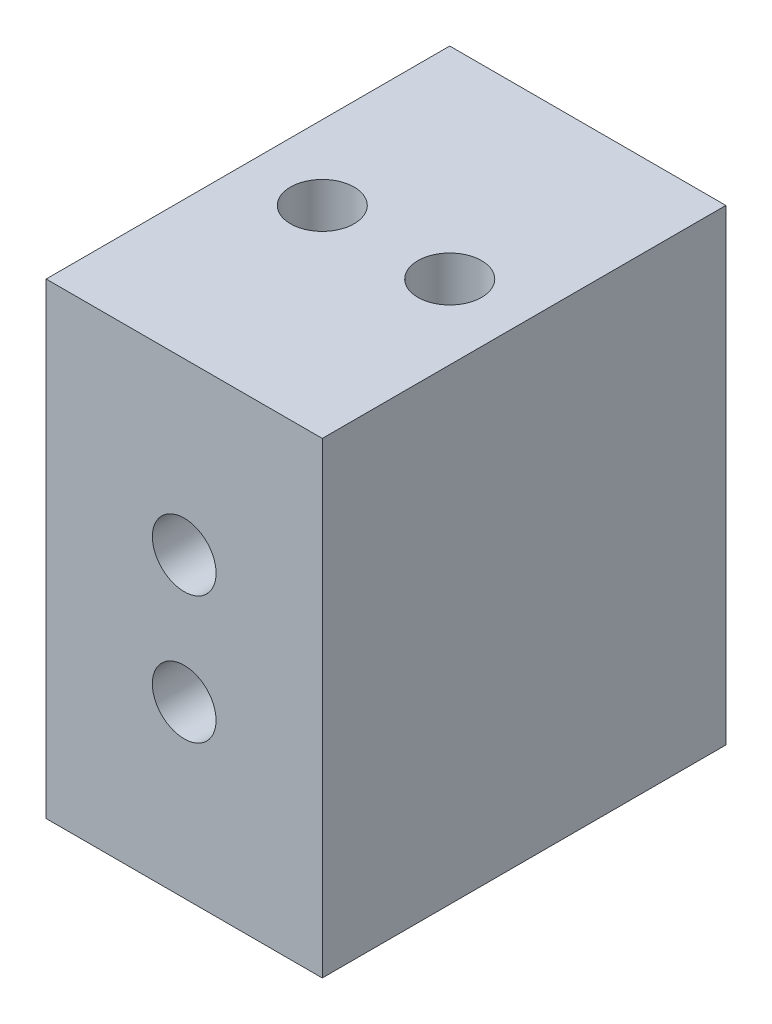
ISO-10303-21;
HEADER;
FILE_DESCRIPTION(('STEP AP214'),'2;1');
FILE_NAME('part.step','',(''),(''),'','','');
FILE_SCHEMA(('AUTOMOTIVE_DESIGN { 1 0 10303 214 1 1 1 1 }'));
ENDSEC;
DATA;
#1=APPLICATION_CONTEXT('core data for automotive mechanical design processes');
#2=APPLICATION_PROTOCOL_DEFINITION('international standard','automotive_design',2000,#1);
#3=PRODUCT_CONTEXT('',#1,'mechanical');
#4=PRODUCT('Part','Part','',(#3));
#5=PRODUCT_RELATED_PRODUCT_CATEGORY('part','',(#4));
#6=PRODUCT_DEFINITION_FORMATION('','',#4);
#7=PRODUCT_DEFINITION_CONTEXT('part definition',#1,'design');
#8=PRODUCT_DEFINITION('design','',#6,#7);
#9=PRODUCT_DEFINITION_SHAPE('','',#8);
#10=(LENGTH_UNIT() NAMED_UNIT(*) SI_UNIT(.MILLI.,.METRE.));
#11=(NAMED_UNIT(*) PLANE_ANGLE_UNIT() SI_UNIT($,.RADIAN.));
#12=(NAMED_UNIT(*) SI_UNIT($,.STERADIAN.) SOLID_ANGLE_UNIT());
#13=UNCERTAINTY_MEASURE_WITH_UNIT(LENGTH_MEASURE(1.E-05),#10,'distance_accuracy_value','');
#14=(GEOMETRIC_REPRESENTATION_CONTEXT(3) GLOBAL_UNCERTAINTY_ASSIGNED_CONTEXT((#13)) GLOBAL_UNIT_ASSIGNED_CONTEXT((#10,
#11,#12)) REPRESENTATION_CONTEXT('',''));
#15=CARTESIAN_POINT('',(0.,0.,0.));
#16=DIRECTION('',(0.,0.,1.));
#17=DIRECTION('',(1.,0.,0.));
#18=AXIS2_PLACEMENT_3D('',#15,#16,#17);
#19=CARTESIAN_POINT('',(6.5,22.,-9.5));
#20=DIRECTION('',(-1.,0.,0.));
#21=DIRECTION('',(0.,0.,1.));
#22=AXIS2_PLACEMENT_3D('',#19,#20,#21);
#23=PLANE('',#22);
#24=DIRECTION('',(0.,0.,-1.));
#25=VECTOR('',#24,1.);
#26=CARTESIAN_POINT('',(6.5,0.,-9.5));
#27=LINE('',#26,#25);
#28=CARTESIAN_POINT('',(6.5,0.,9.5));
#29=VERTEX_POINT('',#28);
#30=CARTESIAN_POINT('',(6.5,0.,-9.5));
#31=VERTEX_POINT('',#30);
#32=EDGE_CURVE('E102',#29,#31,#27,.T.);
#33=ORIENTED_EDGE('',*,*,#32,.T.);
#34=DIRECTION('',(0.,-1.,0.));
#35=VECTOR('',#34,1.);
#36=CARTESIAN_POINT('',(6.5,22.,-9.5));
#37=LINE('',#36,#35);
#38=CARTESIAN_POINT('',(6.5,22.,-9.5));
#39=VERTEX_POINT('',#38);
#40=EDGE_CURVE('E11',#39,#31,#37,.T.);
#41=ORIENTED_EDGE('',*,*,#40,.F.);
#42=DIRECTION('',(0.,0.,-1.));
#43=VECTOR('',#42,1.);
#44=CARTESIAN_POINT('',(6.5,22.,-9.5));
#45=LINE('',#44,#43);
#46=CARTESIAN_POINT('',(6.5,22.,9.5));
#47=VERTEX_POINT('',#46);
#48=EDGE_CURVE('E90',#47,#39,#45,.T.);
#49=ORIENTED_EDGE('',*,*,#48,.F.);
#50=DIRECTION('',(0.,-1.,0.));
#51=VECTOR('',#50,1.);
#52=CARTESIAN_POINT('',(6.5,22.,9.5));
#53=LINE('',#52,#51);
#54=EDGE_CURVE('E98',#47,#29,#53,.T.);
#55=ORIENTED_EDGE('',*,*,#54,.T.);
#56=EDGE_LOOP('',(#33,#41,#49,#55));
#57=FACE_BOUND('',#56,.T.);
#58=ADVANCED_FACE('F39',(#57),#23,.F.);
#59=CARTESIAN_POINT('',(-6.5,22.,-9.5));
#60=DIRECTION('',(0.,0.,1.));
#61=DIRECTION('',(1.,0.,0.));
#62=AXIS2_PLACEMENT_3D('',#59,#60,#61);
#63=PLANE('',#62);
#64=DIRECTION('',(-1.,0.,0.));
#65=VECTOR('',#64,1.);
#66=CARTESIAN_POINT('',(-6.5,0.,-9.5));
#67=LINE('',#66,#65);
#68=CARTESIAN_POINT('',(-6.5,0.,-9.5));
#69=VERTEX_POINT('',#68);
#70=EDGE_CURVE('E94',#31,#69,#67,.T.);
#71=ORIENTED_EDGE('',*,*,#70,.T.);
#72=DIRECTION('',(0.,-1.,0.));
#73=VECTOR('',#72,1.);
#74=CARTESIAN_POINT('',(-6.5,22.,-9.5));
#75=LINE('',#74,#73);
#76=CARTESIAN_POINT('',(-6.5,22.,-9.5));
#77=VERTEX_POINT('',#76);
#78=EDGE_CURVE('E47',#77,#69,#75,.T.);
#79=ORIENTED_EDGE('',*,*,#78,.F.);
#80=DIRECTION('',(-1.,0.,0.));
#81=VECTOR('',#80,1.);
#82=CARTESIAN_POINT('',(-6.5,22.,-9.5));
#83=LINE('',#82,#81);
#84=EDGE_CURVE('E85',#39,#77,#83,.T.);
#85=ORIENTED_EDGE('',*,*,#84,.F.);
#86=ORIENTED_EDGE('',*,*,#40,.T.);
#87=EDGE_LOOP('',(#71,#79,#85,#86));
#88=FACE_BOUND('',#87,.T.);
#89=ADVANCED_FACE('F93',(#88),#63,.F.);
#90=CARTESIAN_POINT('',(-6.5,22.,-9.5));
#91=DIRECTION('',(1.,0.,0.));
#92=DIRECTION('',(0.,0.,-1.));
#93=AXIS2_PLACEMENT_3D('',#90,#91,#92);
#94=PLANE('',#93);
#95=DIRECTION('',(0.,0.,1.));
#96=VECTOR('',#95,1.);
#97=CARTESIAN_POINT('',(-6.5,0.,-9.5));
#98=LINE('',#97,#96);
#99=CARTESIAN_POINT('',(-6.5,0.,9.5));
#100=VERTEX_POINT('',#99);
#101=EDGE_CURVE('E72',#69,#100,#98,.T.);
#102=ORIENTED_EDGE('',*,*,#101,.T.);
#103=DIRECTION('',(0.,-1.,0.));
#104=VECTOR('',#103,1.);
#105=CARTESIAN_POINT('',(-6.5,22.,9.5));
#106=LINE('',#105,#104);
#107=CARTESIAN_POINT('',(-6.5,22.,9.5));
#108=VERTEX_POINT('',#107);
#109=EDGE_CURVE('E95',#108,#100,#106,.T.);
#110=ORIENTED_EDGE('',*,*,#109,.F.);
#111=DIRECTION('',(0.,0.,1.));
#112=VECTOR('',#111,1.);
#113=CARTESIAN_POINT('',(-6.5,22.,-9.5));
#114=LINE('',#113,#112);
#115=EDGE_CURVE('E88',#77,#108,#114,.T.);
#116=ORIENTED_EDGE('',*,*,#115,.F.);
#117=ORIENTED_EDGE('',*,*,#78,.T.);
#118=EDGE_LOOP('',(#102,#110,#116,#117));
#119=FACE_BOUND('',#118,.T.);
#120=ADVANCED_FACE('F96',(#119),#94,.F.);
#121=CARTESIAN_POINT('',(-6.5,22.,9.5));
#122=DIRECTION('',(0.,0.,-1.));
#123=DIRECTION('',(-1.,0.,0.));
#124=AXIS2_PLACEMENT_3D('',#121,#122,#123);
#125=PLANE('',#124);
#126=CARTESIAN_POINT('',(0.,14.,9.5));
#127=DIRECTION('',(0.,0.,1.));
#128=DIRECTION('',(1.,0.,0.));
#129=AXIS2_PLACEMENT_3D('',#126,#127,#128);
#130=CIRCLE('',#129,1.5);
#131=CARTESIAN_POINT('',(1.5,14.,9.5));
#132=VERTEX_POINT('',#131);
#133=EDGE_CURVE('E123',#132,#132,#130,.T.);
#134=ORIENTED_EDGE('',*,*,#133,.F.);
#135=EDGE_LOOP('',(#134));
#136=FACE_BOUND('',#135,.T.);
#137=CARTESIAN_POINT('',(0.,8.,9.5));
#138=DIRECTION('',(0.,0.,1.));
#139=DIRECTION('',(-1.,0.,0.));
#140=AXIS2_PLACEMENT_3D('',#137,#138,#139);
#141=CIRCLE('',#140,1.5);
#142=CARTESIAN_POINT('',(-1.5,8.,9.5));
#143=VERTEX_POINT('',#142);
#144=EDGE_CURVE('E116',#143,#143,#141,.T.);
#145=ORIENTED_EDGE('',*,*,#144,.F.);
#146=EDGE_LOOP('',(#145));
#147=FACE_BOUND('',#146,.T.);
#148=DIRECTION('',(1.,0.,0.));
#149=VECTOR('',#148,1.);
#150=CARTESIAN_POINT('',(-6.5,0.,9.5));
#151=LINE('',#150,#149);
#152=EDGE_CURVE('E78',#100,#29,#151,.T.);
#153=ORIENTED_EDGE('',*,*,#152,.T.);
#154=ORIENTED_EDGE('',*,*,#54,.F.);
#155=DIRECTION('',(1.,0.,0.));
#156=VECTOR('',#155,1.);
#157=CARTESIAN_POINT('',(-6.5,22.,9.5));
#158=LINE('',#157,#156);
#159=EDGE_CURVE('E55',#108,#47,#158,.T.);
#160=ORIENTED_EDGE('',*,*,#159,.F.);
#161=ORIENTED_EDGE('',*,*,#109,.T.);
#162=EDGE_LOOP('',(#153,#154,#160,#161));
#163=FACE_BOUND('',#162,.T.);
#164=ADVANCED_FACE('F110',(#136,#147,#163),#125,.F.);
#165=CARTESIAN_POINT('',(0.,22.,0.));
#166=DIRECTION('',(0.,1.,0.));
#167=DIRECTION('',(0.,0.,1.));
#168=AXIS2_PLACEMENT_3D('',#165,#166,#167);
#169=PLANE('',#168);
#170=CARTESIAN_POINT('',(3.,22.,0.));
#171=DIRECTION('',(0.,1.,0.));
#172=DIRECTION('',(0.,0.,1.));
#173=AXIS2_PLACEMENT_3D('',#170,#171,#172);
#174=CIRCLE('',#173,1.5);
#175=CARTESIAN_POINT('',(3.,22.,1.5));
#176=VERTEX_POINT('',#175);
#177=EDGE_CURVE('E131',#176,#176,#174,.T.);
#178=ORIENTED_EDGE('',*,*,#177,.F.);
#179=EDGE_LOOP('',(#178));
#180=FACE_BOUND('',#179,.T.);
#181=CARTESIAN_POINT('',(-3.,22.,0.));
#182=DIRECTION('',(0.,1.,0.));
#183=DIRECTION('',(0.,0.,-1.));
#184=AXIS2_PLACEMENT_3D('',#181,#182,#183);
#185=CIRCLE('',#184,1.5);
#186=CARTESIAN_POINT('',(-3.,22.,1.5));
#187=VERTEX_POINT('',#186);
#188=EDGE_CURVE('E132',#187,#187,#185,.T.);
#189=ORIENTED_EDGE('',*,*,#188,.F.);
#190=EDGE_LOOP('',(#189));
#191=FACE_BOUND('',#190,.T.);
#192=ORIENTED_EDGE('',*,*,#48,.T.);
#193=ORIENTED_EDGE('',*,*,#84,.T.);
#194=ORIENTED_EDGE('',*,*,#115,.T.);
#195=ORIENTED_EDGE('',*,*,#159,.T.);
#196=EDGE_LOOP('',(#192,#193,#194,#195));
#197=FACE_BOUND('',#196,.T.);
#198=ADVANCED_FACE('F86',(#180,#191,#197),#169,.T.);
#199=CARTESIAN_POINT('',(0.,0.,0.));
#200=DIRECTION('',(0.,1.,0.));
#201=DIRECTION('',(0.,0.,1.));
#202=AXIS2_PLACEMENT_3D('',#199,#200,#201);
#203=PLANE('',#202);
#204=CARTESIAN_POINT('',(3.,0.,0.));
#205=DIRECTION('',(0.,1.,0.));
#206=DIRECTION('',(0.,0.,1.));
#207=AXIS2_PLACEMENT_3D('',#204,#205,#206);
#208=CIRCLE('',#207,1.5);
#209=CARTESIAN_POINT('',(3.,0.,1.5));
#210=VERTEX_POINT('',#209);
#211=EDGE_CURVE('E120',#210,#210,#208,.F.);
#212=ORIENTED_EDGE('',*,*,#211,.F.);
#213=EDGE_LOOP('',(#212));
#214=FACE_BOUND('',#213,.T.);
#215=CARTESIAN_POINT('',(-3.,0.,0.));
#216=DIRECTION('',(0.,1.,0.));
#217=DIRECTION('',(0.,0.,1.));
#218=AXIS2_PLACEMENT_3D('',#215,#216,#217);
#219=CIRCLE('',#218,1.5);
#220=CARTESIAN_POINT('',(-3.,0.,1.5));
#221=VERTEX_POINT('',#220);
#222=EDGE_CURVE('E128',#221,#221,#219,.F.);
#223=ORIENTED_EDGE('',*,*,#222,.F.);
#224=EDGE_LOOP('',(#223));
#225=FACE_BOUND('',#224,.T.);
#226=ORIENTED_EDGE('',*,*,#32,.F.);
#227=ORIENTED_EDGE('',*,*,#152,.F.);
#228=ORIENTED_EDGE('',*,*,#101,.F.);
#229=ORIENTED_EDGE('',*,*,#70,.F.);
#230=EDGE_LOOP('',(#226,#227,#228,#229));
#231=FACE_BOUND('',#230,.T.);
#232=ADVANCED_FACE('F113',(#214,#225,#231),#203,.F.);
#233=CARTESIAN_POINT('',(0.,8.,1.5));
#234=DIRECTION('',(0.,0.,1.));
#235=DIRECTION('',(1.,0.,0.));
#236=AXIS2_PLACEMENT_3D('',#233,#234,#235);
#237=CYLINDRICAL_SURFACE('',#236,1.5);
#238=CARTESIAN_POINT('',(0.,8.,1.5));
#239=DIRECTION('',(0.,0.,1.));
#240=DIRECTION('',(-1.,0.,0.));
#241=AXIS2_PLACEMENT_3D('',#238,#239,#240);
#242=CIRCLE('',#241,1.5);
#243=CARTESIAN_POINT('',(-1.5,8.,1.5));
#244=VERTEX_POINT('',#243);
#245=EDGE_CURVE('E119',#244,#244,#242,.T.);
#246=ORIENTED_EDGE('',*,*,#245,.F.);
#247=EDGE_LOOP('',(#246));
#248=FACE_BOUND('',#247,.T.);
#249=ORIENTED_EDGE('',*,*,#144,.T.);
#250=EDGE_LOOP('',(#249));
#251=FACE_BOUND('',#250,.T.);
#252=ADVANCED_FACE('F174',(#248,#251),#237,.F.);
#253=CARTESIAN_POINT('',(0.,8.,1.5));
#254=DIRECTION('',(0.,0.,-1.));
#255=DIRECTION('',(-1.,0.,0.));
#256=AXIS2_PLACEMENT_3D('',#253,#254,#255);
#257=PLANE('',#256);
#258=ORIENTED_EDGE('',*,*,#245,.T.);
#259=EDGE_LOOP('',(#258));
#260=FACE_BOUND('',#259,.T.);
#261=ADVANCED_FACE('F179',(#260),#257,.F.);
#262=CARTESIAN_POINT('',(0.,14.,1.5));
#263=DIRECTION('',(0.,0.,1.));
#264=DIRECTION('',(1.,0.,0.));
#265=AXIS2_PLACEMENT_3D('',#262,#263,#264);
#266=CYLINDRICAL_SURFACE('',#265,1.5);
#267=CARTESIAN_POINT('',(0.,14.,1.5));
#268=DIRECTION('',(0.,0.,1.));
#269=DIRECTION('',(1.,0.,0.));
#270=AXIS2_PLACEMENT_3D('',#267,#268,#269);
#271=CIRCLE('',#270,1.5);
#272=CARTESIAN_POINT('',(1.5,14.,1.5));
#273=VERTEX_POINT('',#272);
#274=EDGE_CURVE('E105',#273,#273,#271,.T.);
#275=ORIENTED_EDGE('',*,*,#274,.F.);
#276=EDGE_LOOP('',(#275));
#277=FACE_BOUND('',#276,.T.);
#278=ORIENTED_EDGE('',*,*,#133,.T.);
#279=EDGE_LOOP('',(#278));
#280=FACE_BOUND('',#279,.T.);
#281=ADVANCED_FACE('F158',(#277,#280),#266,.F.);
#282=CARTESIAN_POINT('',(0.,14.,1.5));
#283=DIRECTION('',(0.,0.,1.));
#284=DIRECTION('',(1.,0.,0.));
#285=AXIS2_PLACEMENT_3D('',#282,#283,#284);
#286=PLANE('',#285);
#287=ORIENTED_EDGE('',*,*,#274,.T.);
#288=EDGE_LOOP('',(#287));
#289=FACE_BOUND('',#288,.T.);
#290=ADVANCED_FACE('F149',(#289),#286,.T.);
#291=CARTESIAN_POINT('',(-3.,-4.24264068711928,0.));
#292=DIRECTION('',(0.,1.,0.));
#293=DIRECTION('',(0.,0.,1.));
#294=AXIS2_PLACEMENT_3D('',#291,#292,#293);
#295=CYLINDRICAL_SURFACE('',#294,1.5);
#296=CARTESIAN_POINT('',(-3.,0.,1.5));
#297=CARTESIAN_POINT('',(-3.,0.229166666666666,1.5));
#298=CARTESIAN_POINT('',(-3.,0.458333333333332,1.5));
#299=CARTESIAN_POINT('',(-3.,0.916666666666665,1.5));
#300=CARTESIAN_POINT('',(-3.,1.14583333333333,1.5));
#301=CARTESIAN_POINT('',(-3.,1.60416666666667,1.5));
#302=CARTESIAN_POINT('',(-3.,1.83333333333333,1.5));
#303=CARTESIAN_POINT('',(-3.,2.29166666666667,1.5));
#304=CARTESIAN_POINT('',(-3.,2.52083333333333,1.5));
#305=CARTESIAN_POINT('',(-3.,2.97916666666667,1.5));
#306=CARTESIAN_POINT('',(-3.,3.20833333333333,1.5));
#307=CARTESIAN_POINT('',(-3.,3.66666666666667,1.5));
#308=CARTESIAN_POINT('',(-3.,3.89583333333333,1.5));
#309=CARTESIAN_POINT('',(-3.,4.35416666666667,1.5));
#310=CARTESIAN_POINT('',(-3.,4.58333333333333,1.5));
#311=CARTESIAN_POINT('',(-3.,5.04166666666667,1.5));
#312=CARTESIAN_POINT('',(-3.,5.27083333333333,1.5));
#313=CARTESIAN_POINT('',(-3.,5.72916666666666,1.5));
#314=CARTESIAN_POINT('',(-3.,5.95833333333333,1.5));
#315=CARTESIAN_POINT('',(-3.,6.41666666666666,1.5));
#316=CARTESIAN_POINT('',(-3.,6.64583333333333,1.5));
#317=CARTESIAN_POINT('',(-3.,7.10416666666666,1.5));
#318=CARTESIAN_POINT('',(-3.,7.33333333333333,1.5));
#319=CARTESIAN_POINT('',(-3.,7.79166666666666,1.5));
#320=CARTESIAN_POINT('',(-3.,8.02083333333333,1.5));
#321=CARTESIAN_POINT('',(-3.,8.47916666666666,1.5));
#322=CARTESIAN_POINT('',(-3.,8.70833333333333,1.5));
#323=CARTESIAN_POINT('',(-3.,9.16666666666666,1.5));
#324=CARTESIAN_POINT('',(-3.,9.39583333333333,1.5));
#325=CARTESIAN_POINT('',(-3.,9.85416666666666,1.5));
#326=CARTESIAN_POINT('',(-3.,10.0833333333333,1.5));
#327=CARTESIAN_POINT('',(-3.,10.5416666666667,1.5));
#328=CARTESIAN_POINT('',(-3.,10.7708333333333,1.5));
#329=CARTESIAN_POINT('',(-3.,11.2291666666667,1.5));
#330=CARTESIAN_POINT('',(-3.,11.4583333333333,1.5));
#331=CARTESIAN_POINT('',(-3.,11.9166666666667,1.5));
#332=CARTESIAN_POINT('',(-3.,12.1458333333333,1.5));
#333=CARTESIAN_POINT('',(-3.,12.6041666666667,1.5));
#334=CARTESIAN_POINT('',(-3.,12.8333333333333,1.5));
#335=CARTESIAN_POINT('',(-3.,13.2916666666667,1.5));
#336=CARTESIAN_POINT('',(-3.,13.5208333333333,1.5));
#337=CARTESIAN_POINT('',(-3.,13.9791666666667,1.5));
#338=CARTESIAN_POINT('',(-3.,14.2083333333333,1.5));
#339=CARTESIAN_POINT('',(-3.,14.6666666666667,1.5));
#340=CARTESIAN_POINT('',(-3.,14.8958333333333,1.5));
#341=CARTESIAN_POINT('',(-3.,15.3541666666667,1.5));
#342=CARTESIAN_POINT('',(-3.,15.5833333333333,1.5));
#343=CARTESIAN_POINT('',(-3.,16.0416666666667,1.5));
#344=CARTESIAN_POINT('',(-3.,16.2708333333333,1.5));
#345=CARTESIAN_POINT('',(-3.,16.7291666666667,1.5));
#346=CARTESIAN_POINT('',(-3.,16.9583333333333,1.5));
#347=CARTESIAN_POINT('',(-3.,17.4166666666667,1.5));
#348=CARTESIAN_POINT('',(-3.,17.6458333333333,1.5));
#349=CARTESIAN_POINT('',(-3.,18.1041666666667,1.5));
#350=CARTESIAN_POINT('',(-3.,18.3333333333333,1.5));
#351=CARTESIAN_POINT('',(-3.,18.7916666666667,1.5));
#352=CARTESIAN_POINT('',(-3.,19.0208333333333,1.5));
#353=CARTESIAN_POINT('',(-3.,19.4791666666667,1.5));
#354=CARTESIAN_POINT('',(-3.,19.7083333333333,1.5));
#355=CARTESIAN_POINT('',(-3.,20.1666666666667,1.5));
#356=CARTESIAN_POINT('',(-3.,20.3958333333333,1.5));
#357=CARTESIAN_POINT('',(-3.,20.8541666666667,1.5));
#358=CARTESIAN_POINT('',(-3.,21.0833333333333,1.5));
#359=CARTESIAN_POINT('',(-3.,21.5416666666667,1.5));
#360=CARTESIAN_POINT('',(-3.,21.7708333333333,1.5));
#361=CARTESIAN_POINT('',(-3.,22.,1.5));
#362=B_SPLINE_CURVE_WITH_KNOTS('',3,(#296,#297,#298,#299,#300,#301,#302,#303,#304,#305,#306,
#307,#308,#309,#310,#311,#312,#313,#314,#315,#316,#317,#318,#319,#320,#321,#322,#323,#324,#325,
#326,#327,#328,#329,#330,#331,#332,#333,#334,#335,#336,#337,#338,#339,#340,#341,#342,#343,#344,
#345,#346,#347,#348,#349,#350,#351,#352,#353,#354,#355,#356,#357,#358,#359,#360,#361),
.UNSPECIFIED.,.F.,.F.,(4,2,2,2,2,2,2,2,2,2,2,2,2,2,2,2,2,2,2,2,2,2,2,2,2,2,2,2,2,2,2,2,4),(0.,
0.6875,1.375,2.0625,2.75,3.4375,4.125,4.8125,5.5,6.1875,6.875,7.5625,8.25,8.9375,9.625,10.3125,
11.,11.6875,12.375,13.0625,13.75,14.4375,15.125,15.8125,16.5,17.1875,17.875,18.5625,19.25,
19.9375,20.625,21.3125,22.),.UNSPECIFIED.);
#363=EDGE_CURVE('BSEAM147',#221,#187,#362,.T.);
#364=ORIENTED_EDGE('',*,*,#222,.T.);
#365=ORIENTED_EDGE('',*,*,#188,.T.);
#366=ORIENTED_EDGE('',*,*,#363,.T.);
#367=ORIENTED_EDGE('',*,*,#363,.F.);
#368=EDGE_LOOP('',(#364,#366,#365,#367));
#369=FACE_BOUND('',#368,.T.);
#370=ADVANCED_FACE('F147',(#369),#295,.F.);
#371=CARTESIAN_POINT('',(3.,-4.24264068711928,0.));
#372=DIRECTION('',(0.,1.,0.));
#373=DIRECTION('',(0.,0.,1.));
#374=AXIS2_PLACEMENT_3D('',#371,#372,#373);
#375=CYLINDRICAL_SURFACE('',#374,1.5);
#376=CARTESIAN_POINT('',(3.,0.,1.5));
#377=CARTESIAN_POINT('',(3.,0.229166666666666,1.5));
#378=CARTESIAN_POINT('',(3.,0.458333333333332,1.5));
#379=CARTESIAN_POINT('',(3.,0.916666666666665,1.5));
#380=CARTESIAN_POINT('',(3.,1.14583333333333,1.5));
#381=CARTESIAN_POINT('',(3.,1.60416666666667,1.5));
#382=CARTESIAN_POINT('',(3.,1.83333333333333,1.5));
#383=CARTESIAN_POINT('',(3.,2.29166666666667,1.5));
#384=CARTESIAN_POINT('',(3.,2.52083333333333,1.5));
#385=CARTESIAN_POINT('',(3.,2.97916666666667,1.5));
#386=CARTESIAN_POINT('',(3.,3.20833333333333,1.5));
#387=CARTESIAN_POINT('',(3.,3.66666666666667,1.5));
#388=CARTESIAN_POINT('',(3.,3.89583333333333,1.5));
#389=CARTESIAN_POINT('',(3.,4.35416666666667,1.5));
#390=CARTESIAN_POINT('',(3.,4.58333333333333,1.5));
#391=CARTESIAN_POINT('',(3.,5.04166666666667,1.5));
#392=CARTESIAN_POINT('',(3.,5.27083333333333,1.5));
#393=CARTESIAN_POINT('',(3.,5.72916666666666,1.5));
#394=CARTESIAN_POINT('',(3.,5.95833333333333,1.5));
#395=CARTESIAN_POINT('',(3.,6.41666666666666,1.5));
#396=CARTESIAN_POINT('',(3.,6.64583333333333,1.5));
#397=CARTESIAN_POINT('',(3.,7.10416666666666,1.5));
#398=CARTESIAN_POINT('',(3.,7.33333333333333,1.5));
#399=CARTESIAN_POINT('',(3.,7.79166666666666,1.5));
#400=CARTESIAN_POINT('',(3.,8.02083333333333,1.5));
#401=CARTESIAN_POINT('',(3.,8.47916666666666,1.5));
#402=CARTESIAN_POINT('',(3.,8.70833333333333,1.5));
#403=CARTESIAN_POINT('',(3.,9.16666666666666,1.5));
#404=CARTESIAN_POINT('',(3.,9.39583333333333,1.5));
#405=CARTESIAN_POINT('',(3.,9.85416666666666,1.5));
#406=CARTESIAN_POINT('',(3.,10.0833333333333,1.5));
#407=CARTESIAN_POINT('',(3.,10.5416666666667,1.5));
#408=CARTESIAN_POINT('',(3.,10.7708333333333,1.5));
#409=CARTESIAN_POINT('',(3.,11.2291666666667,1.5));
#410=CARTESIAN_POINT('',(3.,11.4583333333333,1.5));
#411=CARTESIAN_POINT('',(3.,11.9166666666667,1.5));
#412=CARTESIAN_POINT('',(3.,12.1458333333333,1.5));
#413=CARTESIAN_POINT('',(3.,12.6041666666667,1.5));
#414=CARTESIAN_POINT('',(3.,12.8333333333333,1.5));
#415=CARTESIAN_POINT('',(3.,13.2916666666667,1.5));
#416=CARTESIAN_POINT('',(3.,13.5208333333333,1.5));
#417=CARTESIAN_POINT('',(3.,13.9791666666667,1.5));
#418=CARTESIAN_POINT('',(3.,14.2083333333333,1.5));
#419=CARTESIAN_POINT('',(3.,14.6666666666667,1.5));
#420=CARTESIAN_POINT('',(3.,14.8958333333333,1.5));
#421=CARTESIAN_POINT('',(3.,15.3541666666667,1.5));
#422=CARTESIAN_POINT('',(3.,15.5833333333333,1.5));
#423=CARTESIAN_POINT('',(3.,16.0416666666667,1.5));
#424=CARTESIAN_POINT('',(3.,16.2708333333333,1.5));
#425=CARTESIAN_POINT('',(3.,16.7291666666667,1.5));
#426=CARTESIAN_POINT('',(3.,16.9583333333333,1.5));
#427=CARTESIAN_POINT('',(3.,17.4166666666667,1.5));
#428=CARTESIAN_POINT('',(3.,17.6458333333333,1.5));
#429=CARTESIAN_POINT('',(3.,18.1041666666667,1.5));
#430=CARTESIAN_POINT('',(3.,18.3333333333333,1.5));
#431=CARTESIAN_POINT('',(3.,18.7916666666667,1.5));
#432=CARTESIAN_POINT('',(3.,19.0208333333333,1.5));
#433=CARTESIAN_POINT('',(3.,19.4791666666667,1.5));
#434=CARTESIAN_POINT('',(3.,19.7083333333333,1.5));
#435=CARTESIAN_POINT('',(3.,20.1666666666667,1.5));
#436=CARTESIAN_POINT('',(3.,20.3958333333333,1.5));
#437=CARTESIAN_POINT('',(3.,20.8541666666667,1.5));
#438=CARTESIAN_POINT('',(3.,21.0833333333333,1.5));
#439=CARTESIAN_POINT('',(3.,21.5416666666667,1.5));
#440=CARTESIAN_POINT('',(3.,21.7708333333333,1.5));
#441=CARTESIAN_POINT('',(3.,22.,1.5));
#442=B_SPLINE_CURVE_WITH_KNOTS('',3,(#376,#377,#378,#379,#380,#381,#382,#383,#384,#385,#386,
#387,#388,#389,#390,#391,#392,#393,#394,#395,#396,#397,#398,#399,#400,#401,#402,#403,#404,#405,
#406,#407,#408,#409,#410,#411,#412,#413,#414,#415,#416,#417,#418,#419,#420,#421,#422,#423,#424,
#425,#426,#427,#428,#429,#430,#431,#432,#433,#434,#435,#436,#437,#438,#439,#440,#441),
.UNSPECIFIED.,.F.,.F.,(4,2,2,2,2,2,2,2,2,2,2,2,2,2,2,2,2,2,2,2,2,2,2,2,2,2,2,2,2,2,2,2,4),(0.,
0.6875,1.375,2.0625,2.75,3.4375,4.125,4.8125,5.5,6.1875,6.875,7.5625,8.25,8.9375,9.625,10.3125,
11.,11.6875,12.375,13.0625,13.75,14.4375,15.125,15.8125,16.5,17.1875,17.875,18.5625,19.25,
19.9375,20.625,21.3125,22.),.UNSPECIFIED.);
#443=EDGE_CURVE('BSEAM140',#210,#176,#442,.T.);
#444=ORIENTED_EDGE('',*,*,#211,.T.);
#445=ORIENTED_EDGE('',*,*,#177,.T.);
#446=ORIENTED_EDGE('',*,*,#443,.T.);
#447=ORIENTED_EDGE('',*,*,#443,.F.);
#448=EDGE_LOOP('',(#444,#446,#445,#447));
#449=FACE_BOUND('',#448,.T.);
#450=ADVANCED_FACE('F140',(#449),#375,.F.);
#451=CLOSED_SHELL('',(#58,#89,#120,#164,#198,#232,#252,#261,#281,#290,#370,#450));
#452=MANIFOLD_SOLID_BREP('B2',#451);
#453=ADVANCED_BREP_SHAPE_REPRESENTATION('',(#18,#452),#14);
#454=SHAPE_DEFINITION_REPRESENTATION(#9,#453);
ENDSEC;
END-ISO-10303-21;
